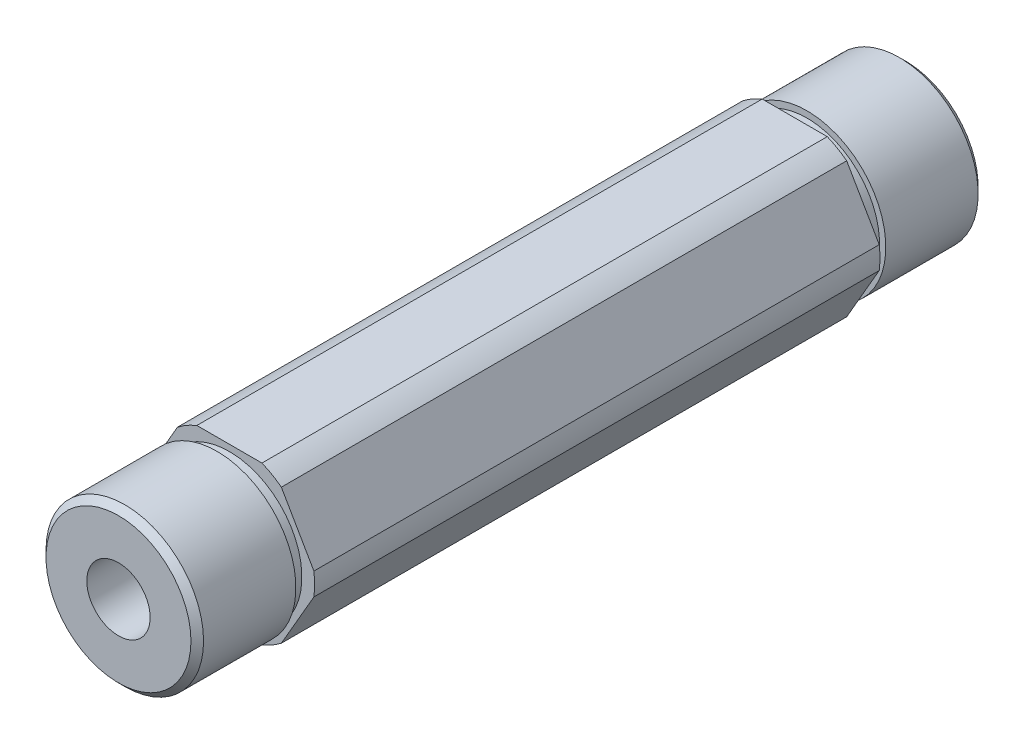
ISO-10303-21;
HEADER;
FILE_DESCRIPTION(('STEP AP214'),'2;1');
FILE_NAME('part.step','',(''),(''),'','','');
FILE_SCHEMA(('AUTOMOTIVE_DESIGN { 1 0 10303 214 1 1 1 1 }'));
ENDSEC;
DATA;
#1=APPLICATION_CONTEXT('core data for automotive mechanical design processes');
#2=APPLICATION_PROTOCOL_DEFINITION('international standard','automotive_design',2000,#1);
#3=PRODUCT_CONTEXT('',#1,'mechanical');
#4=PRODUCT('Part','Part','',(#3));
#5=PRODUCT_RELATED_PRODUCT_CATEGORY('part','',(#4));
#6=PRODUCT_DEFINITION_FORMATION('','',#4);
#7=PRODUCT_DEFINITION_CONTEXT('part definition',#1,'design');
#8=PRODUCT_DEFINITION('design','',#6,#7);
#9=PRODUCT_DEFINITION_SHAPE('','',#8);
#10=(LENGTH_UNIT() NAMED_UNIT(*) SI_UNIT(.MILLI.,.METRE.));
#11=(NAMED_UNIT(*) PLANE_ANGLE_UNIT() SI_UNIT($,.RADIAN.));
#12=(NAMED_UNIT(*) SI_UNIT($,.STERADIAN.) SOLID_ANGLE_UNIT());
#13=UNCERTAINTY_MEASURE_WITH_UNIT(LENGTH_MEASURE(1.E-05),#10,'distance_accuracy_value','');
#14=(GEOMETRIC_REPRESENTATION_CONTEXT(3) GLOBAL_UNCERTAINTY_ASSIGNED_CONTEXT((#13)) GLOBAL_UNIT_ASSIGNED_CONTEXT((#10,
#11,#12)) REPRESENTATION_CONTEXT('',''));
#15=CARTESIAN_POINT('',(0.,0.,0.));
#16=DIRECTION('',(0.,0.,1.));
#17=DIRECTION('',(1.,0.,0.));
#18=AXIS2_PLACEMENT_3D('',#15,#16,#17);
#19=CARTESIAN_POINT('',(0.,5.842,-8.9408));
#20=DIRECTION('',(0.,0.,1.));
#21=DIRECTION('',(1.,0.,0.));
#22=AXIS2_PLACEMENT_3D('',#19,#20,#21);
#23=PLANE('',#22);
#24=CARTESIAN_POINT('',(0.,0.,-8.9408));
#25=DIRECTION('',(0.,0.,-1.));
#26=DIRECTION('',(-1.,0.,0.));
#27=AXIS2_PLACEMENT_3D('',#24,#25,#26);
#28=CIRCLE('',#27,5.842);
#29=CARTESIAN_POINT('',(-5.842,0.,-8.9408));
#30=VERTEX_POINT('',#29);
#31=EDGE_CURVE('E149',#30,#30,#28,.T.);
#32=ORIENTED_EDGE('',*,*,#31,.T.);
#33=EDGE_LOOP('',(#32));
#34=FACE_BOUND('',#33,.T.);
#35=CARTESIAN_POINT('',(0.,0.,-8.9408));
#36=DIRECTION('',(0.,0.,-1.));
#37=DIRECTION('',(-1.,0.,0.));
#38=AXIS2_PLACEMENT_3D('',#35,#36,#37);
#39=CIRCLE('',#38,6.8707);
#40=CARTESIAN_POINT('',(2.62374131537391,6.35,-8.9408));
#41=VERTEX_POINT('',#40);
#42=CARTESIAN_POINT('',(4.18739065634423,5.44722663207261,-8.9408));
#43=VERTEX_POINT('',#42);
#44=EDGE_CURVE('E150',#41,#43,#39,.T.);
#45=ORIENTED_EDGE('',*,*,#44,.F.);
#46=DIRECTION('',(-1.,0.,0.));
#47=VECTOR('',#46,1.);
#48=CARTESIAN_POINT('',(3.66617420935412,6.35,-8.9408));
#49=LINE('',#48,#47);
#50=CARTESIAN_POINT('',(-2.62374131537391,6.35,-8.9408));
#51=VERTEX_POINT('',#50);
#52=EDGE_CURVE('E135',#41,#51,#49,.T.);
#53=ORIENTED_EDGE('',*,*,#52,.T.);
#54=CARTESIAN_POINT('',(-4.18739065634423,5.44722663207261,-8.9408));
#55=VERTEX_POINT('',#54);
#56=EDGE_CURVE('E142',#55,#51,#39,.T.);
#57=ORIENTED_EDGE('',*,*,#56,.F.);
#58=DIRECTION('',(-0.5,-0.866025403784439,0.));
#59=VECTOR('',#58,1.);
#60=CARTESIAN_POINT('',(-3.66617420935413,6.35,-8.9408));
#61=LINE('',#60,#59);
#62=CARTESIAN_POINT('',(-6.81113197171814,0.902773367927384,-8.9408));
#63=VERTEX_POINT('',#62);
#64=EDGE_CURVE('E123',#55,#63,#61,.T.);
#65=ORIENTED_EDGE('',*,*,#64,.T.);
#66=CARTESIAN_POINT('',(-6.81113197171814,-0.902773367927396,-8.9408));
#67=VERTEX_POINT('',#66);
#68=EDGE_CURVE('E152',#67,#63,#39,.T.);
#69=ORIENTED_EDGE('',*,*,#68,.F.);
#70=DIRECTION('',(0.5,-0.866025403784438,0.));
#71=VECTOR('',#70,1.);
#72=CARTESIAN_POINT('',(-7.33234841870825,0.,-8.9408));
#73=LINE('',#72,#71);
#74=CARTESIAN_POINT('',(-4.18739065634423,-5.44722663207261,-8.9408));
#75=VERTEX_POINT('',#74);
#76=EDGE_CURVE('E134',#67,#75,#73,.T.);
#77=ORIENTED_EDGE('',*,*,#76,.T.);
#78=CARTESIAN_POINT('',(-2.62374131537391,-6.35,-8.9408));
#79=VERTEX_POINT('',#78);
#80=EDGE_CURVE('E159',#79,#75,#39,.T.);
#81=ORIENTED_EDGE('',*,*,#80,.F.);
#82=DIRECTION('',(1.,0.,0.));
#83=VECTOR('',#82,1.);
#84=CARTESIAN_POINT('',(-3.66617420935412,-6.35,-8.9408));
#85=LINE('',#84,#83);
#86=CARTESIAN_POINT('',(2.62374131537391,-6.35,-8.9408));
#87=VERTEX_POINT('',#86);
#88=EDGE_CURVE('E234',#79,#87,#85,.T.);
#89=ORIENTED_EDGE('',*,*,#88,.T.);
#90=CARTESIAN_POINT('',(4.18739065634423,-5.44722663207261,-8.9408));
#91=VERTEX_POINT('',#90);
#92=EDGE_CURVE('E162',#91,#87,#39,.T.);
#93=ORIENTED_EDGE('',*,*,#92,.F.);
#94=DIRECTION('',(0.5,0.866025403784439,0.));
#95=VECTOR('',#94,1.);
#96=CARTESIAN_POINT('',(3.66617420935412,-6.35,-8.9408));
#97=LINE('',#96,#95);
#98=CARTESIAN_POINT('',(6.81113197171814,-0.902773367927384,-8.9408));
#99=VERTEX_POINT('',#98);
#100=EDGE_CURVE('E231',#91,#99,#97,.T.);
#101=ORIENTED_EDGE('',*,*,#100,.T.);
#102=CARTESIAN_POINT('',(6.81113197171814,0.902773367927397,-8.9408));
#103=VERTEX_POINT('',#102);
#104=EDGE_CURVE('E157',#103,#99,#39,.T.);
#105=ORIENTED_EDGE('',*,*,#104,.F.);
#106=DIRECTION('',(-0.5,0.866025403784438,0.));
#107=VECTOR('',#106,1.);
#108=CARTESIAN_POINT('',(7.33234841870825,0.,-8.9408));
#109=LINE('',#108,#107);
#110=EDGE_CURVE('E228',#103,#43,#109,.T.);
#111=ORIENTED_EDGE('',*,*,#110,.T.);
#112=EDGE_LOOP('',(#45,#53,#57,#65,#69,#77,#81,#89,#93,#101,#105,#111));
#113=FACE_BOUND('',#112,.T.);
#114=ADVANCED_FACE('F35',(#34,#113),#23,.T.);
#115=CARTESIAN_POINT('',(0.,0.,0.));
#116=DIRECTION('',(0.,0.,-1.));
#117=DIRECTION('',(-1.,0.,0.));
#118=AXIS2_PLACEMENT_3D('',#115,#116,#117);
#119=CYLINDRICAL_SURFACE('',#118,6.8707);
#120=CARTESIAN_POINT('',(0.,0.,-54.5084));
#121=DIRECTION('',(0.,0.,-1.));
#122=DIRECTION('',(-1.,0.,0.));
#123=AXIS2_PLACEMENT_3D('',#120,#121,#122);
#124=CIRCLE('',#123,6.8707);
#125=CARTESIAN_POINT('',(2.62374131537391,6.35,-54.5084));
#126=VERTEX_POINT('',#125);
#127=CARTESIAN_POINT('',(4.18739065634423,5.44722663207261,-54.5084));
#128=VERTEX_POINT('',#127);
#129=EDGE_CURVE('E163',#126,#128,#124,.T.);
#130=ORIENTED_EDGE('',*,*,#129,.F.);
#131=DIRECTION('',(0.,0.,-1.));
#132=VECTOR('',#131,1.);
#133=CARTESIAN_POINT('',(2.62374131537391,6.35,0.));
#134=LINE('',#133,#132);
#135=EDGE_CURVE('E189',#126,#41,#134,.F.);
#136=ORIENTED_EDGE('',*,*,#135,.T.);
#137=ORIENTED_EDGE('',*,*,#44,.T.);
#138=DIRECTION('',(0.,0.,-1.));
#139=VECTOR('',#138,1.);
#140=CARTESIAN_POINT('',(4.18739065634423,5.44722663207261,0.));
#141=LINE('',#140,#139);
#142=EDGE_CURVE('E199',#43,#128,#141,.T.);
#143=ORIENTED_EDGE('',*,*,#142,.T.);
#144=EDGE_LOOP('',(#130,#136,#137,#143));
#145=FACE_BOUND('',#144,.T.);
#146=ADVANCED_FACE('F263',(#145),#119,.T.);
#147=ORIENTED_EDGE('',*,*,#56,.T.);
#148=DIRECTION('',(0.,0.,-1.));
#149=VECTOR('',#148,1.);
#150=CARTESIAN_POINT('',(-2.62374131537391,6.35,0.));
#151=LINE('',#150,#149);
#152=CARTESIAN_POINT('',(-2.62374131537391,6.35,-54.5084));
#153=VERTEX_POINT('',#152);
#154=EDGE_CURVE('E192',#51,#153,#151,.T.);
#155=ORIENTED_EDGE('',*,*,#154,.T.);
#156=CARTESIAN_POINT('',(-4.18739065634423,5.44722663207261,-54.5084));
#157=VERTEX_POINT('',#156);
#158=EDGE_CURVE('E144',#157,#153,#124,.T.);
#159=ORIENTED_EDGE('',*,*,#158,.F.);
#160=DIRECTION('',(0.,0.,-1.));
#161=VECTOR('',#160,1.);
#162=CARTESIAN_POINT('',(-4.18739065634423,5.44722663207261,0.));
#163=LINE('',#162,#161);
#164=EDGE_CURVE('E126',#157,#55,#163,.F.);
#165=ORIENTED_EDGE('',*,*,#164,.T.);
#166=EDGE_LOOP('',(#147,#155,#159,#165));
#167=FACE_BOUND('',#166,.T.);
#168=ADVANCED_FACE('F140',(#167),#119,.T.);
#169=CARTESIAN_POINT('',(6.81113197171814,0.902773367927397,-54.5084));
#170=VERTEX_POINT('',#169);
#171=CARTESIAN_POINT('',(6.81113197171814,-0.902773367927385,-54.5084));
#172=VERTEX_POINT('',#171);
#173=EDGE_CURVE('E168',#170,#172,#124,.T.);
#174=ORIENTED_EDGE('',*,*,#173,.F.);
#175=DIRECTION('',(0.,0.,-1.));
#176=VECTOR('',#175,1.);
#177=CARTESIAN_POINT('',(6.81113197171814,0.902773367927395,0.));
#178=LINE('',#177,#176);
#179=EDGE_CURVE('E196',#170,#103,#178,.F.);
#180=ORIENTED_EDGE('',*,*,#179,.T.);
#181=ORIENTED_EDGE('',*,*,#104,.T.);
#182=DIRECTION('',(0.,0.,-1.));
#183=VECTOR('',#182,1.);
#184=CARTESIAN_POINT('',(6.81113197171814,-0.902773367927383,0.));
#185=LINE('',#184,#183);
#186=EDGE_CURVE('E208',#99,#172,#185,.T.);
#187=ORIENTED_EDGE('',*,*,#186,.T.);
#188=EDGE_LOOP('',(#174,#180,#181,#187));
#189=FACE_BOUND('',#188,.T.);
#190=ADVANCED_FACE('F255',(#189),#119,.T.);
#191=CARTESIAN_POINT('',(4.18739065634423,-5.44722663207261,-54.5084));
#192=VERTEX_POINT('',#191);
#193=CARTESIAN_POINT('',(2.62374131537391,-6.35,-54.5084));
#194=VERTEX_POINT('',#193);
#195=EDGE_CURVE('E175',#192,#194,#124,.T.);
#196=ORIENTED_EDGE('',*,*,#195,.F.);
#197=DIRECTION('',(0.,0.,-1.));
#198=VECTOR('',#197,1.);
#199=CARTESIAN_POINT('',(4.18739065634423,-5.44722663207261,0.));
#200=LINE('',#199,#198);
#201=EDGE_CURVE('E205',#192,#91,#200,.F.);
#202=ORIENTED_EDGE('',*,*,#201,.T.);
#203=ORIENTED_EDGE('',*,*,#92,.T.);
#204=DIRECTION('',(0.,0.,-1.));
#205=VECTOR('',#204,1.);
#206=CARTESIAN_POINT('',(2.62374131537391,-6.35,0.));
#207=LINE('',#206,#205);
#208=EDGE_CURVE('E215',#87,#194,#207,.T.);
#209=ORIENTED_EDGE('',*,*,#208,.T.);
#210=EDGE_LOOP('',(#196,#202,#203,#209));
#211=FACE_BOUND('',#210,.T.);
#212=ADVANCED_FACE('F249',(#211),#119,.T.);
#213=CARTESIAN_POINT('',(-2.62374131537391,-6.35,-54.5084));
#214=VERTEX_POINT('',#213);
#215=CARTESIAN_POINT('',(-4.18739065634422,-5.44722663207261,-54.5084));
#216=VERTEX_POINT('',#215);
#217=EDGE_CURVE('E171',#214,#216,#124,.T.);
#218=ORIENTED_EDGE('',*,*,#217,.F.);
#219=DIRECTION('',(0.,0.,-1.));
#220=VECTOR('',#219,1.);
#221=CARTESIAN_POINT('',(-2.62374131537391,-6.35,0.));
#222=LINE('',#221,#220);
#223=EDGE_CURVE('E58',#214,#79,#222,.F.);
#224=ORIENTED_EDGE('',*,*,#223,.T.);
#225=ORIENTED_EDGE('',*,*,#80,.T.);
#226=DIRECTION('',(0.,0.,-1.));
#227=VECTOR('',#226,1.);
#228=CARTESIAN_POINT('',(-4.18739065634423,-5.44722663207261,0.));
#229=LINE('',#228,#227);
#230=EDGE_CURVE('E221',#75,#216,#229,.T.);
#231=ORIENTED_EDGE('',*,*,#230,.T.);
#232=EDGE_LOOP('',(#218,#224,#225,#231));
#233=FACE_BOUND('',#232,.T.);
#234=ADVANCED_FACE('F242',(#233),#119,.T.);
#235=CARTESIAN_POINT('',(-6.81113197171814,-0.902773367927389,-54.5084));
#236=VERTEX_POINT('',#235);
#237=CARTESIAN_POINT('',(-6.81113197171814,0.902773367927388,-54.5084));
#238=VERTEX_POINT('',#237);
#239=EDGE_CURVE('E164',#236,#238,#124,.T.);
#240=ORIENTED_EDGE('',*,*,#239,.F.);
#241=DIRECTION('',(0.,0.,-1.));
#242=VECTOR('',#241,1.);
#243=CARTESIAN_POINT('',(-6.81113197171814,-0.902773367927396,0.));
#244=LINE('',#243,#242);
#245=EDGE_CURVE('E50',#236,#67,#244,.F.);
#246=ORIENTED_EDGE('',*,*,#245,.T.);
#247=ORIENTED_EDGE('',*,*,#68,.T.);
#248=DIRECTION('',(0.,0.,-1.));
#249=VECTOR('',#248,1.);
#250=CARTESIAN_POINT('',(-6.81113197171814,0.902773367927384,0.));
#251=LINE('',#250,#249);
#252=EDGE_CURVE('E129',#63,#238,#251,.T.);
#253=ORIENTED_EDGE('',*,*,#252,.T.);
#254=EDGE_LOOP('',(#240,#246,#247,#253));
#255=FACE_BOUND('',#254,.T.);
#256=ADVANCED_FACE('F284',(#255),#119,.T.);
#257=CARTESIAN_POINT('',(0.,6.8707,-54.5084));
#258=DIRECTION('',(0.,0.,-1.));
#259=DIRECTION('',(-1.,0.,0.));
#260=AXIS2_PLACEMENT_3D('',#257,#258,#259);
#261=PLANE('',#260);
#262=CARTESIAN_POINT('',(0.,0.,-54.5084));
#263=DIRECTION('',(0.,0.,-1.));
#264=DIRECTION('',(-1.,0.,0.));
#265=AXIS2_PLACEMENT_3D('',#262,#263,#264);
#266=CIRCLE('',#265,5.842);
#267=CARTESIAN_POINT('',(-5.842,0.,-54.5084));
#268=VERTEX_POINT('',#267);
#269=EDGE_CURVE('E172',#268,#268,#266,.T.);
#270=ORIENTED_EDGE('',*,*,#269,.F.);
#271=EDGE_LOOP('',(#270));
#272=FACE_BOUND('',#271,.T.);
#273=ORIENTED_EDGE('',*,*,#158,.T.);
#274=DIRECTION('',(1.,0.,0.));
#275=VECTOR('',#274,1.);
#276=CARTESIAN_POINT('',(0.,6.35,-54.5084));
#277=LINE('',#276,#275);
#278=EDGE_CURVE('E194',#153,#126,#277,.T.);
#279=ORIENTED_EDGE('',*,*,#278,.T.);
#280=ORIENTED_EDGE('',*,*,#129,.T.);
#281=DIRECTION('',(0.5,-0.866025403784439,0.));
#282=VECTOR('',#281,1.);
#283=CARTESIAN_POINT('',(2.52416094314031,8.328025,-54.5084));
#284=LINE('',#283,#282);
#285=EDGE_CURVE('E202',#128,#170,#284,.T.);
#286=ORIENTED_EDGE('',*,*,#285,.T.);
#287=ORIENTED_EDGE('',*,*,#173,.T.);
#288=DIRECTION('',(-0.5,-0.866025403784439,0.));
#289=VECTOR('',#288,1.);
#290=CARTESIAN_POINT('',(8.47436168492206,1.97802500000001,-54.5084));
#291=LINE('',#290,#289);
#292=EDGE_CURVE('E211',#172,#192,#291,.T.);
#293=ORIENTED_EDGE('',*,*,#292,.T.);
#294=ORIENTED_EDGE('',*,*,#195,.T.);
#295=DIRECTION('',(-1.,0.,0.));
#296=VECTOR('',#295,1.);
#297=CARTESIAN_POINT('',(0.,-6.35,-54.5084));
#298=LINE('',#297,#296);
#299=EDGE_CURVE('E218',#194,#214,#298,.T.);
#300=ORIENTED_EDGE('',*,*,#299,.T.);
#301=ORIENTED_EDGE('',*,*,#217,.T.);
#302=DIRECTION('',(-0.5,0.866025403784438,0.));
#303=VECTOR('',#302,1.);
#304=CARTESIAN_POINT('',(-8.47436168492206,1.978025,-54.5084));
#305=LINE('',#304,#303);
#306=EDGE_CURVE('E145',#216,#236,#305,.T.);
#307=ORIENTED_EDGE('',*,*,#306,.T.);
#308=ORIENTED_EDGE('',*,*,#239,.T.);
#309=DIRECTION('',(0.5,0.866025403784439,0.));
#310=VECTOR('',#309,1.);
#311=CARTESIAN_POINT('',(-2.52416094314032,8.328025,-54.5084));
#312=LINE('',#311,#310);
#313=EDGE_CURVE('E226',#238,#157,#312,.T.);
#314=ORIENTED_EDGE('',*,*,#313,.T.);
#315=EDGE_LOOP('',(#273,#279,#280,#286,#287,#293,#294,#300,#301,#307,#308,#314));
#316=FACE_BOUND('',#315,.T.);
#317=ADVANCED_FACE('F243',(#272,#316),#261,.T.);
#318=CARTESIAN_POINT('',(0.,2.55270000000008,0.));
#319=DIRECTION('',(0.,0.,1.));
#320=DIRECTION('',(1.,0.,0.));
#321=AXIS2_PLACEMENT_3D('',#318,#319,#320);
#322=PLANE('',#321);
#323=CARTESIAN_POINT('',(0.,0.,0.));
#324=DIRECTION('',(0.,0.,1.));
#325=DIRECTION('',(1.,0.,0.));
#326=AXIS2_PLACEMENT_3D('',#323,#324,#325);
#327=CIRCLE('',#326,5.84199999999999);
#328=CARTESIAN_POINT('',(5.84199999999999,0.,0.));
#329=VERTEX_POINT('',#328);
#330=EDGE_CURVE('E12',#329,#329,#327,.T.);
#331=ORIENTED_EDGE('',*,*,#330,.T.);
#332=EDGE_LOOP('',(#331));
#333=FACE_BOUND('',#332,.T.);
#334=CARTESIAN_POINT('',(0.,0.,0.));
#335=DIRECTION('',(0.,0.,-1.));
#336=DIRECTION('',(-1.,0.,0.));
#337=AXIS2_PLACEMENT_3D('',#334,#335,#336);
#338=CIRCLE('',#337,2.55270000000008);
#339=CARTESIAN_POINT('',(-2.55270000000008,0.,0.));
#340=VERTEX_POINT('',#339);
#341=EDGE_CURVE('E311',#340,#340,#338,.T.);
#342=ORIENTED_EDGE('',*,*,#341,.T.);
#343=EDGE_LOOP('',(#342));
#344=FACE_BOUND('',#343,.T.);
#345=ADVANCED_FACE('F299',(#333,#344),#322,.T.);
#346=CARTESIAN_POINT('',(0.,0.,0.));
#347=DIRECTION('',(0.,0.,-1.));
#348=DIRECTION('',(-1.,0.,0.));
#349=AXIS2_PLACEMENT_3D('',#346,#347,#348);
#350=CYLINDRICAL_SURFACE('',#349,6.35);
#351=CARTESIAN_POINT('',(0.,0.,-0.508000000000012));
#352=DIRECTION('',(0.,0.,1.));
#353=DIRECTION('',(1.,0.,0.));
#354=AXIS2_PLACEMENT_3D('',#351,#352,#353);
#355=CIRCLE('',#354,6.35);
#356=CARTESIAN_POINT('',(6.35,0.,-0.508000000000012));
#357=VERTEX_POINT('',#356);
#358=EDGE_CURVE('E43',#357,#357,#355,.F.);
#359=ORIENTED_EDGE('',*,*,#358,.T.);
#360=EDGE_LOOP('',(#359));
#361=FACE_BOUND('',#360,.T.);
#362=CARTESIAN_POINT('',(0.,0.,-7.9502));
#363=DIRECTION('',(0.,0.,-1.));
#364=DIRECTION('',(-1.,0.,0.));
#365=AXIS2_PLACEMENT_3D('',#362,#363,#364);
#366=CIRCLE('',#365,6.35);
#367=CARTESIAN_POINT('',(-6.35,0.,-7.9502));
#368=VERTEX_POINT('',#367);
#369=EDGE_CURVE('E314',#368,#368,#366,.T.);
#370=ORIENTED_EDGE('',*,*,#369,.F.);
#371=EDGE_LOOP('',(#370));
#372=FACE_BOUND('',#371,.T.);
#373=ADVANCED_FACE('F295',(#361,#372),#350,.T.);
#374=CARTESIAN_POINT('',(0.,6.35,-7.9502));
#375=DIRECTION('',(0.,0.,-1.));
#376=DIRECTION('',(-1.,0.,0.));
#377=AXIS2_PLACEMENT_3D('',#374,#375,#376);
#378=PLANE('',#377);
#379=ORIENTED_EDGE('',*,*,#369,.T.);
#380=EDGE_LOOP('',(#379));
#381=FACE_BOUND('',#380,.T.);
#382=CARTESIAN_POINT('',(0.,0.,-7.9502));
#383=DIRECTION('',(0.,0.,-1.));
#384=DIRECTION('',(-1.,0.,0.));
#385=AXIS2_PLACEMENT_3D('',#382,#383,#384);
#386=CIRCLE('',#385,5.842);
#387=CARTESIAN_POINT('',(-5.842,0.,-7.9502));
#388=VERTEX_POINT('',#387);
#389=EDGE_CURVE('E154',#388,#388,#386,.T.);
#390=ORIENTED_EDGE('',*,*,#389,.F.);
#391=EDGE_LOOP('',(#390));
#392=FACE_BOUND('',#391,.T.);
#393=ADVANCED_FACE('F291',(#381,#392),#378,.T.);
#394=CARTESIAN_POINT('',(0.,0.,0.));
#395=DIRECTION('',(0.,0.,-1.));
#396=DIRECTION('',(-1.,0.,0.));
#397=AXIS2_PLACEMENT_3D('',#394,#395,#396);
#398=CYLINDRICAL_SURFACE('',#397,5.842);
#399=ORIENTED_EDGE('',*,*,#389,.T.);
#400=EDGE_LOOP('',(#399));
#401=FACE_BOUND('',#400,.T.);
#402=ORIENTED_EDGE('',*,*,#31,.F.);
#403=EDGE_LOOP('',(#402));
#404=FACE_BOUND('',#403,.T.);
#405=ADVANCED_FACE('F287',(#401,#404),#398,.T.);
#406=CARTESIAN_POINT('',(0.,0.,0.));
#407=DIRECTION('',(0.,0.,-1.));
#408=DIRECTION('',(-1.,0.,0.));
#409=AXIS2_PLACEMENT_3D('',#406,#407,#408);
#410=CYLINDRICAL_SURFACE('',#409,5.842);
#411=ORIENTED_EDGE('',*,*,#269,.T.);
#412=EDGE_LOOP('',(#411));
#413=FACE_BOUND('',#412,.T.);
#414=CARTESIAN_POINT('',(0.,0.,-55.499));
#415=DIRECTION('',(0.,0.,-1.));
#416=DIRECTION('',(-1.,0.,0.));
#417=AXIS2_PLACEMENT_3D('',#414,#415,#416);
#418=CIRCLE('',#417,5.842);
#419=CARTESIAN_POINT('',(-5.842,0.,-55.499));
#420=VERTEX_POINT('',#419);
#421=EDGE_CURVE('E177',#420,#420,#418,.T.);
#422=ORIENTED_EDGE('',*,*,#421,.F.);
#423=EDGE_LOOP('',(#422));
#424=FACE_BOUND('',#423,.T.);
#425=ADVANCED_FACE('F290',(#413,#424),#410,.T.);
#426=CARTESIAN_POINT('',(0.,5.842,-55.499));
#427=DIRECTION('',(0.,0.,1.));
#428=DIRECTION('',(1.,0.,0.));
#429=AXIS2_PLACEMENT_3D('',#426,#427,#428);
#430=PLANE('',#429);
#431=ORIENTED_EDGE('',*,*,#421,.T.);
#432=EDGE_LOOP('',(#431));
#433=FACE_BOUND('',#432,.T.);
#434=CARTESIAN_POINT('',(0.,0.,-55.499));
#435=DIRECTION('',(0.,0.,-1.));
#436=DIRECTION('',(-1.,0.,0.));
#437=AXIS2_PLACEMENT_3D('',#434,#435,#436);
#438=CIRCLE('',#437,6.35);
#439=CARTESIAN_POINT('',(-6.35,0.,-55.499));
#440=VERTEX_POINT('',#439);
#441=EDGE_CURVE('E181',#440,#440,#438,.T.);
#442=ORIENTED_EDGE('',*,*,#441,.F.);
#443=EDGE_LOOP('',(#442));
#444=FACE_BOUND('',#443,.T.);
#445=ADVANCED_FACE('F360',(#433,#444),#430,.T.);
#446=CARTESIAN_POINT('',(0.,0.,0.));
#447=DIRECTION('',(0.,0.,-1.));
#448=DIRECTION('',(-1.,0.,0.));
#449=AXIS2_PLACEMENT_3D('',#446,#447,#448);
#450=CYLINDRICAL_SURFACE('',#449,6.35);
#451=CARTESIAN_POINT('',(0.,0.,-62.9412));
#452=DIRECTION('',(0.,0.,-1.));
#453=DIRECTION('',(-1.,0.,0.));
#454=AXIS2_PLACEMENT_3D('',#451,#452,#453);
#455=CIRCLE('',#454,6.35);
#456=CARTESIAN_POINT('',(-6.35,0.,-62.9412));
#457=VERTEX_POINT('',#456);
#458=EDGE_CURVE('E317',#457,#457,#455,.F.);
#459=ORIENTED_EDGE('',*,*,#458,.T.);
#460=EDGE_LOOP('',(#459));
#461=FACE_BOUND('',#460,.T.);
#462=ORIENTED_EDGE('',*,*,#441,.T.);
#463=EDGE_LOOP('',(#462));
#464=FACE_BOUND('',#463,.T.);
#465=ADVANCED_FACE('F348',(#461,#464),#450,.T.);
#466=CARTESIAN_POINT('',(0.,6.35,-63.4492));
#467=DIRECTION('',(0.,0.,-1.));
#468=DIRECTION('',(-1.,0.,0.));
#469=AXIS2_PLACEMENT_3D('',#466,#467,#468);
#470=PLANE('',#469);
#471=CARTESIAN_POINT('',(0.,0.,-63.4492));
#472=DIRECTION('',(0.,0.,-1.));
#473=DIRECTION('',(-1.,0.,0.));
#474=AXIS2_PLACEMENT_3D('',#471,#472,#473);
#475=CIRCLE('',#474,5.842);
#476=CARTESIAN_POINT('',(-5.842,0.,-63.4492));
#477=VERTEX_POINT('',#476);
#478=EDGE_CURVE('E313',#477,#477,#475,.T.);
#479=ORIENTED_EDGE('',*,*,#478,.T.);
#480=EDGE_LOOP('',(#479));
#481=FACE_BOUND('',#480,.T.);
#482=CARTESIAN_POINT('',(0.,0.,-63.4492));
#483=DIRECTION('',(0.,0.,-1.));
#484=DIRECTION('',(-1.,0.,0.));
#485=AXIS2_PLACEMENT_3D('',#482,#483,#484);
#486=CIRCLE('',#485,2.5527);
#487=CARTESIAN_POINT('',(-2.5527,0.,-63.4492));
#488=VERTEX_POINT('',#487);
#489=EDGE_CURVE('E186',#488,#488,#486,.T.);
#490=ORIENTED_EDGE('',*,*,#489,.F.);
#491=EDGE_LOOP('',(#490));
#492=FACE_BOUND('',#491,.T.);
#493=ADVANCED_FACE('F342',(#481,#492),#470,.T.);
#494=CARTESIAN_POINT('',(0.,0.,0.));
#495=DIRECTION('',(0.,0.,-1.));
#496=DIRECTION('',(-1.,0.,0.));
#497=AXIS2_PLACEMENT_3D('',#494,#495,#496);
#498=CYLINDRICAL_SURFACE('',#497,2.55270000000004);
#499=ORIENTED_EDGE('',*,*,#489,.T.);
#500=EDGE_LOOP('',(#499));
#501=FACE_BOUND('',#500,.T.);
#502=ORIENTED_EDGE('',*,*,#341,.F.);
#503=EDGE_LOOP('',(#502));
#504=FACE_BOUND('',#503,.T.);
#505=ADVANCED_FACE('F347',(#501,#504),#498,.F.);
#506=CARTESIAN_POINT('',(-3.66617420935413,6.35,-63.4492));
#507=DIRECTION('',(-0.866025403784439,0.499999999999999,0.));
#508=DIRECTION('',(-0.5,-0.866025403784439,0.));
#509=AXIS2_PLACEMENT_3D('',#506,#507,#508);
#510=PLANE('',#509);
#511=ORIENTED_EDGE('',*,*,#313,.F.);
#512=ORIENTED_EDGE('',*,*,#252,.F.);
#513=ORIENTED_EDGE('',*,*,#64,.F.);
#514=ORIENTED_EDGE('',*,*,#164,.F.);
#515=EDGE_LOOP('',(#511,#512,#513,#514));
#516=FACE_BOUND('',#515,.T.);
#517=ADVANCED_FACE('F125',(#516),#510,.T.);
#518=CARTESIAN_POINT('',(-7.33234841870825,0.,-63.4492));
#519=DIRECTION('',(-0.866025403784438,-0.5,0.));
#520=DIRECTION('',(0.5,-0.866025403784438,0.));
#521=AXIS2_PLACEMENT_3D('',#518,#519,#520);
#522=PLANE('',#521);
#523=ORIENTED_EDGE('',*,*,#306,.F.);
#524=ORIENTED_EDGE('',*,*,#230,.F.);
#525=ORIENTED_EDGE('',*,*,#76,.F.);
#526=ORIENTED_EDGE('',*,*,#245,.F.);
#527=EDGE_LOOP('',(#523,#524,#525,#526));
#528=FACE_BOUND('',#527,.T.);
#529=ADVANCED_FACE('F400',(#528),#522,.T.);
#530=CARTESIAN_POINT('',(-3.66617420935412,-6.35,-63.4492));
#531=DIRECTION('',(0.,-1.,0.));
#532=DIRECTION('',(1.,0.,0.));
#533=AXIS2_PLACEMENT_3D('',#530,#531,#532);
#534=PLANE('',#533);
#535=ORIENTED_EDGE('',*,*,#299,.F.);
#536=ORIENTED_EDGE('',*,*,#208,.F.);
#537=ORIENTED_EDGE('',*,*,#88,.F.);
#538=ORIENTED_EDGE('',*,*,#223,.F.);
#539=EDGE_LOOP('',(#535,#536,#537,#538));
#540=FACE_BOUND('',#539,.T.);
#541=ADVANCED_FACE('F246',(#540),#534,.T.);
#542=CARTESIAN_POINT('',(3.66617420935412,-6.35,-63.4492));
#543=DIRECTION('',(0.866025403784439,-0.5,0.));
#544=DIRECTION('',(0.5,0.866025403784439,0.));
#545=AXIS2_PLACEMENT_3D('',#542,#543,#544);
#546=PLANE('',#545);
#547=ORIENTED_EDGE('',*,*,#292,.F.);
#548=ORIENTED_EDGE('',*,*,#186,.F.);
#549=ORIENTED_EDGE('',*,*,#100,.F.);
#550=ORIENTED_EDGE('',*,*,#201,.F.);
#551=EDGE_LOOP('',(#547,#548,#549,#550));
#552=FACE_BOUND('',#551,.T.);
#553=ADVANCED_FACE('F258',(#552),#546,.T.);
#554=CARTESIAN_POINT('',(7.33234841870825,0.,-63.4492));
#555=DIRECTION('',(0.866025403784438,0.5,0.));
#556=DIRECTION('',(-0.5,0.866025403784439,0.));
#557=AXIS2_PLACEMENT_3D('',#554,#555,#556);
#558=PLANE('',#557);
#559=ORIENTED_EDGE('',*,*,#285,.F.);
#560=ORIENTED_EDGE('',*,*,#142,.F.);
#561=ORIENTED_EDGE('',*,*,#110,.F.);
#562=ORIENTED_EDGE('',*,*,#179,.F.);
#563=EDGE_LOOP('',(#559,#560,#561,#562));
#564=FACE_BOUND('',#563,.T.);
#565=ADVANCED_FACE('F261',(#564),#558,.T.);
#566=CARTESIAN_POINT('',(3.66617420935412,6.35,-63.4492));
#567=DIRECTION('',(0.,1.,0.));
#568=DIRECTION('',(-1.,0.,0.));
#569=AXIS2_PLACEMENT_3D('',#566,#567,#568);
#570=PLANE('',#569);
#571=ORIENTED_EDGE('',*,*,#278,.F.);
#572=ORIENTED_EDGE('',*,*,#154,.F.);
#573=ORIENTED_EDGE('',*,*,#52,.F.);
#574=ORIENTED_EDGE('',*,*,#135,.F.);
#575=EDGE_LOOP('',(#571,#572,#573,#574));
#576=FACE_BOUND('',#575,.T.);
#577=ADVANCED_FACE('F265',(#576),#570,.T.);
#578=CARTESIAN_POINT('',(0.,0.,-63.4492));
#579=DIRECTION('',(0.,0.,1.));
#580=DIRECTION('',(1.,0.,0.));
#581=AXIS2_PLACEMENT_3D('',#578,#579,#580);
#582=CONICAL_SURFACE('',#581,5.842,0.785398163397453);
#583=ORIENTED_EDGE('',*,*,#458,.F.);
#584=EDGE_LOOP('',(#583));
#585=FACE_BOUND('',#584,.T.);
#586=ORIENTED_EDGE('',*,*,#478,.F.);
#587=EDGE_LOOP('',(#586));
#588=FACE_BOUND('',#587,.T.);
#589=ADVANCED_FACE('F267',(#585,#588),#582,.T.);
#590=CARTESIAN_POINT('',(0.,0.,-0.508000000000012));
#591=DIRECTION('',(0.,0.,-1.));
#592=DIRECTION('',(-1.,0.,0.));
#593=AXIS2_PLACEMENT_3D('',#590,#591,#592);
#594=CONICAL_SURFACE('',#593,6.35,0.785398163397442);
#595=ORIENTED_EDGE('',*,*,#330,.F.);
#596=EDGE_LOOP('',(#595));
#597=FACE_BOUND('',#596,.T.);
#598=ORIENTED_EDGE('',*,*,#358,.F.);
#599=EDGE_LOOP('',(#598));
#600=FACE_BOUND('',#599,.T.);
#601=ADVANCED_FACE('F37',(#597,#600),#594,.T.);
#602=CLOSED_SHELL('',(#114,#146,#168,#190,#212,#234,#256,#317,#345,#373,#393,#405,#425,#445,
#465,#493,#505,#517,#529,#541,#553,#565,#577,#589,#601));
#603=MANIFOLD_SOLID_BREP('B2',#602);
#604=ADVANCED_BREP_SHAPE_REPRESENTATION('',(#18,#603),#14);
#605=SHAPE_DEFINITION_REPRESENTATION(#9,#604);
ENDSEC;
END-ISO-10303-21;
